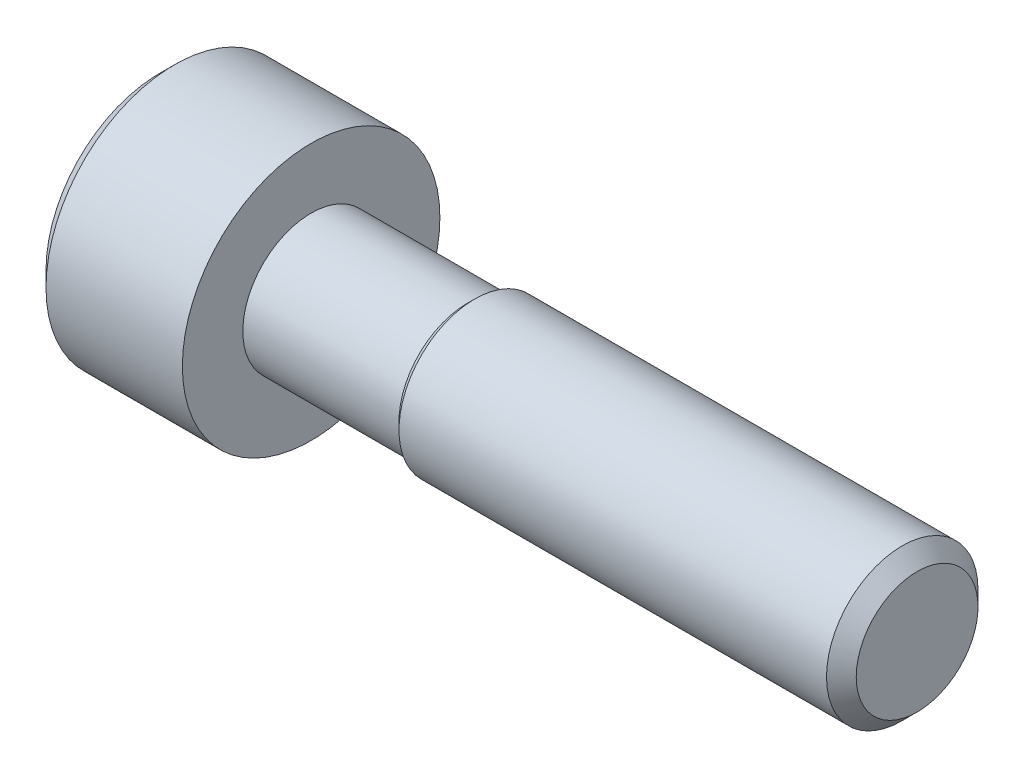
ISO-10303-21;
HEADER;
FILE_DESCRIPTION(('STEP AP214'),'2;1');
FILE_NAME('part.step','',(''),(''),'','','');
FILE_SCHEMA(('AUTOMOTIVE_DESIGN { 1 0 10303 214 1 1 1 1 }'));
ENDSEC;
DATA;
#1=APPLICATION_CONTEXT('core data for automotive mechanical design processes');
#2=APPLICATION_PROTOCOL_DEFINITION('international standard','automotive_design',2000,#1);
#3=PRODUCT_CONTEXT('',#1,'mechanical');
#4=PRODUCT('Part','Part','',(#3));
#5=PRODUCT_RELATED_PRODUCT_CATEGORY('part','',(#4));
#6=PRODUCT_DEFINITION_FORMATION('','',#4);
#7=PRODUCT_DEFINITION_CONTEXT('part definition',#1,'design');
#8=PRODUCT_DEFINITION('design','',#6,#7);
#9=PRODUCT_DEFINITION_SHAPE('','',#8);
#10=(LENGTH_UNIT() NAMED_UNIT(*) SI_UNIT(.MILLI.,.METRE.));
#11=(NAMED_UNIT(*) PLANE_ANGLE_UNIT() SI_UNIT($,.RADIAN.));
#12=(NAMED_UNIT(*) SI_UNIT($,.STERADIAN.) SOLID_ANGLE_UNIT());
#13=UNCERTAINTY_MEASURE_WITH_UNIT(LENGTH_MEASURE(1.E-05),#10,'distance_accuracy_value','');
#14=(GEOMETRIC_REPRESENTATION_CONTEXT(3) GLOBAL_UNCERTAINTY_ASSIGNED_CONTEXT((#13)) GLOBAL_UNIT_ASSIGNED_CONTEXT((#10,
#11,#12)) REPRESENTATION_CONTEXT('',''));
#15=CARTESIAN_POINT('',(0.,0.,0.));
#16=DIRECTION('',(0.,0.,1.));
#17=DIRECTION('',(1.,0.,0.));
#18=AXIS2_PLACEMENT_3D('',#15,#16,#17);
#19=CARTESIAN_POINT('',(-2.5,0.,0.));
#20=DIRECTION('',(1.,0.,0.));
#21=DIRECTION('',(0.,0.,-1.));
#22=AXIS2_PLACEMENT_3D('',#19,#20,#21);
#23=PLANE('',#22);
#24=DIRECTION('',(0.,1.,0.));
#25=VECTOR('',#24,1.);
#26=CARTESIAN_POINT('',(-2.5,0.,2.));
#27=LINE('',#26,#25);
#28=CARTESIAN_POINT('',(-2.5,1.15470053837925,2.));
#29=VERTEX_POINT('',#28);
#30=CARTESIAN_POINT('',(-2.49999999999886,0.,2.00000000000477));
#31=VERTEX_POINT('',#30);
#32=EDGE_CURVE('E87',#29,#31,#27,.F.);
#33=ORIENTED_EDGE('',*,*,#32,.F.);
#34=DIRECTION('',(0.,-0.500000000000003,0.866025403784437));
#35=VECTOR('',#34,1.);
#36=CARTESIAN_POINT('',(-2.5,1.73205080756888,1.));
#37=LINE('',#36,#35);
#38=CARTESIAN_POINT('',(-2.49999999999886,1.73205080757301,1.00000000000239));
#39=VERTEX_POINT('',#38);
#40=EDGE_CURVE('E108',#39,#29,#37,.T.);
#41=ORIENTED_EDGE('',*,*,#40,.F.);
#42=CARTESIAN_POINT('',(-2.49999999999773,0.,0.));
#43=DIRECTION('',(-1.,0.,0.));
#44=DIRECTION('',(0.,0.,1.));
#45=AXIS2_PLACEMENT_3D('',#42,#43,#44);
#46=CIRCLE('',#45,2.00000000000955);
#47=EDGE_CURVE('E20',#39,#31,#46,.F.);
#48=ORIENTED_EDGE('',*,*,#47,.T.);
#49=EDGE_LOOP('',(#33,#41,#48));
#50=FACE_BOUND('',#49,.T.);
#51=ADVANCED_FACE('F17',(#50),#23,.F.);
#52=CARTESIAN_POINT('',(-2.5,0.,0.));
#53=DIRECTION('',(1.,0.,0.));
#54=DIRECTION('',(0.,0.,-1.));
#55=AXIS2_PLACEMENT_3D('',#52,#53,#54);
#56=PLANE('',#55);
#57=DIRECTION('',(0.,-0.500000000000003,-0.866025403784437));
#58=VECTOR('',#57,1.);
#59=CARTESIAN_POINT('',(-2.5,-1.15470053837925,2.));
#60=LINE('',#59,#58);
#61=CARTESIAN_POINT('',(-2.5,-1.15470053837925,2.));
#62=VERTEX_POINT('',#61);
#63=CARTESIAN_POINT('',(-2.49999999999886,-1.73205080757301,1.00000000000239));
#64=VERTEX_POINT('',#63);
#65=EDGE_CURVE('E127',#62,#64,#60,.T.);
#66=ORIENTED_EDGE('',*,*,#65,.F.);
#67=DIRECTION('',(0.,1.,0.));
#68=VECTOR('',#67,1.);
#69=CARTESIAN_POINT('',(-2.5,0.,2.));
#70=LINE('',#69,#68);
#71=EDGE_CURVE('E139',#31,#62,#70,.F.);
#72=ORIENTED_EDGE('',*,*,#71,.F.);
#73=CARTESIAN_POINT('',(-2.49999999999773,0.,0.));
#74=DIRECTION('',(-1.,0.,0.));
#75=DIRECTION('',(0.,0.,1.));
#76=AXIS2_PLACEMENT_3D('',#73,#74,#75);
#77=CIRCLE('',#76,2.00000000000955);
#78=EDGE_CURVE('E118',#31,#64,#77,.F.);
#79=ORIENTED_EDGE('',*,*,#78,.T.);
#80=EDGE_LOOP('',(#66,#72,#79));
#81=FACE_BOUND('',#80,.T.);
#82=ADVANCED_FACE('F252',(#81),#56,.F.);
#83=CARTESIAN_POINT('',(-2.5,0.,0.));
#84=DIRECTION('',(1.,0.,0.));
#85=DIRECTION('',(0.,0.,-1.));
#86=AXIS2_PLACEMENT_3D('',#83,#84,#85);
#87=PLANE('',#86);
#88=DIRECTION('',(0.,0.500000000000003,0.866025403784437));
#89=VECTOR('',#88,1.);
#90=CARTESIAN_POINT('',(-2.5,1.15470053837925,-2.));
#91=LINE('',#90,#89);
#92=CARTESIAN_POINT('',(-2.5,1.15470053837925,-2.));
#93=VERTEX_POINT('',#92);
#94=CARTESIAN_POINT('',(-2.49999999999886,1.73205080757301,-1.00000000000239));
#95=VERTEX_POINT('',#94);
#96=EDGE_CURVE('E119',#93,#95,#91,.T.);
#97=ORIENTED_EDGE('',*,*,#96,.F.);
#98=DIRECTION('',(0.,1.,0.));
#99=VECTOR('',#98,1.);
#100=CARTESIAN_POINT('',(-2.5,0.,-2.));
#101=LINE('',#100,#99);
#102=CARTESIAN_POINT('',(-2.49999999999886,0.,-2.00000000000477));
#103=VERTEX_POINT('',#102);
#104=EDGE_CURVE('E121',#103,#93,#101,.T.);
#105=ORIENTED_EDGE('',*,*,#104,.F.);
#106=CARTESIAN_POINT('',(-2.49999999999773,0.,0.));
#107=DIRECTION('',(-1.,0.,0.));
#108=DIRECTION('',(0.,0.,1.));
#109=AXIS2_PLACEMENT_3D('',#106,#107,#108);
#110=CIRCLE('',#109,2.00000000000955);
#111=EDGE_CURVE('E103',#103,#95,#110,.F.);
#112=ORIENTED_EDGE('',*,*,#111,.T.);
#113=EDGE_LOOP('',(#97,#105,#112));
#114=FACE_BOUND('',#113,.T.);
#115=ADVANCED_FACE('F254',(#114),#87,.F.);
#116=CARTESIAN_POINT('',(-2.49999999999773,0.,0.));
#117=DIRECTION('',(-1.,0.,0.));
#118=DIRECTION('',(0.,0.,1.));
#119=AXIS2_PLACEMENT_3D('',#116,#117,#118);
#120=CONICAL_SURFACE('',#119,2.00000000000955,1.04719755114751);
#121=CARTESIAN_POINT('',(-1.34529946163298,1.4210854715202E-10,0.));
#122=VERTEX_POINT('',#121);
#123=VERTEX_LOOP('',#122);
#124=FACE_BOUND('',#123,.T.);
#125=ORIENTED_EDGE('',*,*,#47,.F.);
#126=CARTESIAN_POINT('',(-2.49999999999773,0.,0.));
#127=DIRECTION('',(-1.,0.,0.));
#128=DIRECTION('',(0.,0.,1.));
#129=AXIS2_PLACEMENT_3D('',#126,#127,#128);
#130=CIRCLE('',#129,2.00000000000955);
#131=EDGE_CURVE('E93',#95,#39,#130,.F.);
#132=ORIENTED_EDGE('',*,*,#131,.F.);
#133=ORIENTED_EDGE('',*,*,#111,.F.);
#134=CARTESIAN_POINT('',(-2.49999999999773,0.,0.));
#135=DIRECTION('',(-1.,0.,0.));
#136=DIRECTION('',(0.,0.,1.));
#137=AXIS2_PLACEMENT_3D('',#134,#135,#136);
#138=CIRCLE('',#137,2.00000000000955);
#139=CARTESIAN_POINT('',(-2.49999999999886,-1.73205080757301,-1.00000000000239));
#140=VERTEX_POINT('',#139);
#141=EDGE_CURVE('E177',#103,#140,#138,.T.);
#142=ORIENTED_EDGE('',*,*,#141,.T.);
#143=CARTESIAN_POINT('',(-2.49999999999773,0.,0.));
#144=DIRECTION('',(-1.,0.,0.));
#145=DIRECTION('',(0.,0.,1.));
#146=AXIS2_PLACEMENT_3D('',#143,#144,#145);
#147=CIRCLE('',#146,2.00000000000955);
#148=EDGE_CURVE('E120',#64,#140,#147,.F.);
#149=ORIENTED_EDGE('',*,*,#148,.F.);
#150=ORIENTED_EDGE('',*,*,#78,.F.);
#151=EDGE_LOOP('',(#125,#132,#133,#142,#149,#150));
#152=FACE_BOUND('',#151,.T.);
#153=ADVANCED_FACE('F116',(#124,#152),#120,.F.);
#154=CARTESIAN_POINT('',(-2.5,0.,0.));
#155=DIRECTION('',(1.,0.,0.));
#156=DIRECTION('',(0.,0.,-1.));
#157=AXIS2_PLACEMENT_3D('',#154,#155,#156);
#158=PLANE('',#157);
#159=DIRECTION('',(0.,1.,0.));
#160=VECTOR('',#159,1.);
#161=CARTESIAN_POINT('',(-2.5,0.,-2.));
#162=LINE('',#161,#160);
#163=CARTESIAN_POINT('',(-2.5,-1.15470053837925,-2.));
#164=VERTEX_POINT('',#163);
#165=EDGE_CURVE('E102',#164,#103,#162,.T.);
#166=ORIENTED_EDGE('',*,*,#165,.F.);
#167=DIRECTION('',(0.,0.5,-0.866025403784439));
#168=VECTOR('',#167,1.);
#169=CARTESIAN_POINT('',(-2.5,-1.15470053837925,-2.));
#170=LINE('',#169,#168);
#171=EDGE_CURVE('E192',#164,#140,#170,.F.);
#172=ORIENTED_EDGE('',*,*,#171,.T.);
#173=ORIENTED_EDGE('',*,*,#141,.F.);
#174=EDGE_LOOP('',(#166,#172,#173));
#175=FACE_BOUND('',#174,.T.);
#176=ADVANCED_FACE('F193',(#175),#158,.F.);
#177=CARTESIAN_POINT('',(-2.5,0.,0.));
#178=DIRECTION('',(1.,0.,0.));
#179=DIRECTION('',(0.,0.,-1.));
#180=AXIS2_PLACEMENT_3D('',#177,#178,#179);
#181=PLANE('',#180);
#182=DIRECTION('',(0.,0.5,-0.866025403784439));
#183=VECTOR('',#182,1.);
#184=CARTESIAN_POINT('',(-2.5,-1.15470053837925,-2.));
#185=LINE('',#184,#183);
#186=CARTESIAN_POINT('',(-2.5,-2.3094010767585,0.));
#187=VERTEX_POINT('',#186);
#188=EDGE_CURVE('E186',#140,#187,#185,.F.);
#189=ORIENTED_EDGE('',*,*,#188,.T.);
#190=DIRECTION('',(0.,-0.5,-0.866025403784439));
#191=VECTOR('',#190,1.);
#192=CARTESIAN_POINT('',(-2.5,-2.3094010767585,0.));
#193=LINE('',#192,#191);
#194=EDGE_CURVE('E179',#187,#64,#193,.F.);
#195=ORIENTED_EDGE('',*,*,#194,.T.);
#196=ORIENTED_EDGE('',*,*,#148,.T.);
#197=EDGE_LOOP('',(#189,#195,#196));
#198=FACE_BOUND('',#197,.T.);
#199=ADVANCED_FACE('F184',(#198),#181,.F.);
#200=CARTESIAN_POINT('',(-2.5,0.,0.));
#201=DIRECTION('',(1.,0.,0.));
#202=DIRECTION('',(0.,0.,-1.));
#203=AXIS2_PLACEMENT_3D('',#200,#201,#202);
#204=PLANE('',#203);
#205=DIRECTION('',(0.,-0.5,0.866025403784439));
#206=VECTOR('',#205,1.);
#207=CARTESIAN_POINT('',(-2.5,1.15470053837925,2.));
#208=LINE('',#207,#206);
#209=CARTESIAN_POINT('',(-2.5,2.3094010767585,0.));
#210=VERTEX_POINT('',#209);
#211=EDGE_CURVE('E96',#39,#210,#208,.F.);
#212=ORIENTED_EDGE('',*,*,#211,.T.);
#213=DIRECTION('',(0.,0.5,0.866025403784439));
#214=VECTOR('',#213,1.);
#215=CARTESIAN_POINT('',(-2.5,2.3094010767585,0.));
#216=LINE('',#215,#214);
#217=EDGE_CURVE('E98',#210,#95,#216,.F.);
#218=ORIENTED_EDGE('',*,*,#217,.T.);
#219=ORIENTED_EDGE('',*,*,#131,.T.);
#220=EDGE_LOOP('',(#212,#218,#219));
#221=FACE_BOUND('',#220,.T.);
#222=ADVANCED_FACE('F95',(#221),#204,.F.);
#223=CARTESIAN_POINT('',(-5.,-2.3094010767585,0.));
#224=DIRECTION('',(0.,-0.866025403784439,0.5));
#225=DIRECTION('',(0.,-0.5,-0.866025403784439));
#226=AXIS2_PLACEMENT_3D('',#223,#224,#225);
#227=PLANE('',#226);
#228=DIRECTION('',(1.,0.,0.));
#229=VECTOR('',#228,1.);
#230=CARTESIAN_POINT('',(-5.,-1.15470053837925,2.));
#231=LINE('',#230,#229);
#232=CARTESIAN_POINT('',(-5.,-1.15470053837925,2.));
#233=VERTEX_POINT('',#232);
#234=EDGE_CURVE('E153',#233,#62,#231,.T.);
#235=ORIENTED_EDGE('',*,*,#234,.T.);
#236=ORIENTED_EDGE('',*,*,#65,.T.);
#237=ORIENTED_EDGE('',*,*,#194,.F.);
#238=DIRECTION('',(1.,0.,0.));
#239=VECTOR('',#238,1.);
#240=CARTESIAN_POINT('',(-5.,-2.3094010767585,0.));
#241=LINE('',#240,#239);
#242=CARTESIAN_POINT('',(-5.,-2.3094010767585,0.));
#243=VERTEX_POINT('',#242);
#244=EDGE_CURVE('E201',#187,#243,#241,.F.);
#245=ORIENTED_EDGE('',*,*,#244,.T.);
#246=DIRECTION('',(0.,-0.499999999999999,-0.866025403784439));
#247=VECTOR('',#246,1.);
#248=CARTESIAN_POINT('',(-5.,-1.15470053837925,2.));
#249=LINE('',#248,#247);
#250=EDGE_CURVE('E159',#233,#243,#249,.T.);
#251=ORIENTED_EDGE('',*,*,#250,.F.);
#252=EDGE_LOOP('',(#235,#236,#237,#245,#251));
#253=FACE_BOUND('',#252,.T.);
#254=ADVANCED_FACE('F248',(#253),#227,.F.);
#255=CARTESIAN_POINT('',(-5.,-1.15470053837925,-2.));
#256=DIRECTION('',(0.,-0.866025403784439,-0.5));
#257=DIRECTION('',(0.,0.5,-0.866025403784439));
#258=AXIS2_PLACEMENT_3D('',#255,#256,#257);
#259=PLANE('',#258);
#260=ORIENTED_EDGE('',*,*,#244,.F.);
#261=ORIENTED_EDGE('',*,*,#188,.F.);
#262=ORIENTED_EDGE('',*,*,#171,.F.);
#263=DIRECTION('',(-1.,0.,0.));
#264=VECTOR('',#263,1.);
#265=CARTESIAN_POINT('',(-5.,-1.15470053837925,-2.));
#266=LINE('',#265,#264);
#267=CARTESIAN_POINT('',(-5.,-1.15470053837925,-2.));
#268=VERTEX_POINT('',#267);
#269=EDGE_CURVE('E203',#164,#268,#266,.T.);
#270=ORIENTED_EDGE('',*,*,#269,.T.);
#271=DIRECTION('',(0.,0.499999999999999,-0.866025403784439));
#272=VECTOR('',#271,1.);
#273=CARTESIAN_POINT('',(-5.,-2.3094010767585,0.));
#274=LINE('',#273,#272);
#275=EDGE_CURVE('E240',#243,#268,#274,.T.);
#276=ORIENTED_EDGE('',*,*,#275,.F.);
#277=EDGE_LOOP('',(#260,#261,#262,#270,#276));
#278=FACE_BOUND('',#277,.T.);
#279=ADVANCED_FACE('F199',(#278),#259,.F.);
#280=CARTESIAN_POINT('',(-5.,1.15470053837925,-2.));
#281=DIRECTION('',(0.,0.,-1.));
#282=DIRECTION('',(-1.,0.,0.));
#283=AXIS2_PLACEMENT_3D('',#280,#281,#282);
#284=PLANE('',#283);
#285=ORIENTED_EDGE('',*,*,#269,.F.);
#286=ORIENTED_EDGE('',*,*,#165,.T.);
#287=ORIENTED_EDGE('',*,*,#104,.T.);
#288=DIRECTION('',(1.,0.,0.));
#289=VECTOR('',#288,1.);
#290=CARTESIAN_POINT('',(-5.,1.15470053837925,-2.));
#291=LINE('',#290,#289);
#292=CARTESIAN_POINT('',(-5.,1.15470053837925,-2.));
#293=VERTEX_POINT('',#292);
#294=EDGE_CURVE('E110',#93,#293,#291,.F.);
#295=ORIENTED_EDGE('',*,*,#294,.T.);
#296=DIRECTION('',(0.,1.,0.));
#297=VECTOR('',#296,1.);
#298=CARTESIAN_POINT('',(-5.,2.875,-2.));
#299=LINE('',#298,#297);
#300=EDGE_CURVE('E238',#268,#293,#299,.T.);
#301=ORIENTED_EDGE('',*,*,#300,.F.);
#302=EDGE_LOOP('',(#285,#286,#287,#295,#301));
#303=FACE_BOUND('',#302,.T.);
#304=ADVANCED_FACE('F308',(#303),#284,.F.);
#305=CARTESIAN_POINT('',(-5.,2.3094010767585,0.));
#306=DIRECTION('',(0.,0.866025403784439,-0.5));
#307=DIRECTION('',(0.,0.5,0.866025403784439));
#308=AXIS2_PLACEMENT_3D('',#305,#306,#307);
#309=PLANE('',#308);
#310=ORIENTED_EDGE('',*,*,#294,.F.);
#311=ORIENTED_EDGE('',*,*,#96,.T.);
#312=ORIENTED_EDGE('',*,*,#217,.F.);
#313=DIRECTION('',(1.,0.,0.));
#314=VECTOR('',#313,1.);
#315=CARTESIAN_POINT('',(-5.,2.3094010767585,0.));
#316=LINE('',#315,#314);
#317=CARTESIAN_POINT('',(-5.,2.3094010767585,0.));
#318=VERTEX_POINT('',#317);
#319=EDGE_CURVE('E109',#210,#318,#316,.F.);
#320=ORIENTED_EDGE('',*,*,#319,.T.);
#321=DIRECTION('',(0.,0.499999999999999,0.866025403784439));
#322=VECTOR('',#321,1.);
#323=CARTESIAN_POINT('',(-5.,1.15470053837925,-2.));
#324=LINE('',#323,#322);
#325=EDGE_CURVE('E229',#293,#318,#324,.T.);
#326=ORIENTED_EDGE('',*,*,#325,.F.);
#327=EDGE_LOOP('',(#310,#311,#312,#320,#326));
#328=FACE_BOUND('',#327,.T.);
#329=ADVANCED_FACE('F227',(#328),#309,.F.);
#330=CARTESIAN_POINT('',(-5.,1.15470053837925,2.));
#331=DIRECTION('',(0.,0.866025403784439,0.5));
#332=DIRECTION('',(0.,-0.5,0.866025403784439));
#333=AXIS2_PLACEMENT_3D('',#330,#331,#332);
#334=PLANE('',#333);
#335=ORIENTED_EDGE('',*,*,#319,.F.);
#336=ORIENTED_EDGE('',*,*,#211,.F.);
#337=ORIENTED_EDGE('',*,*,#40,.T.);
#338=DIRECTION('',(1.,0.,0.));
#339=VECTOR('',#338,1.);
#340=CARTESIAN_POINT('',(-5.,1.15470053837925,2.));
#341=LINE('',#340,#339);
#342=CARTESIAN_POINT('',(-5.,1.15470053837925,2.));
#343=VERTEX_POINT('',#342);
#344=EDGE_CURVE('E35',#29,#343,#341,.F.);
#345=ORIENTED_EDGE('',*,*,#344,.T.);
#346=DIRECTION('',(0.,-0.499999999999999,0.866025403784439));
#347=VECTOR('',#346,1.);
#348=CARTESIAN_POINT('',(-5.,2.3094010767585,0.));
#349=LINE('',#348,#347);
#350=EDGE_CURVE('E232',#318,#343,#349,.T.);
#351=ORIENTED_EDGE('',*,*,#350,.F.);
#352=EDGE_LOOP('',(#335,#336,#337,#345,#351));
#353=FACE_BOUND('',#352,.T.);
#354=ADVANCED_FACE('F107',(#353),#334,.F.);
#355=CARTESIAN_POINT('',(-5.,-1.15470053837925,2.));
#356=DIRECTION('',(0.,0.,1.));
#357=DIRECTION('',(1.,0.,0.));
#358=AXIS2_PLACEMENT_3D('',#355,#356,#357);
#359=PLANE('',#358);
#360=ORIENTED_EDGE('',*,*,#344,.F.);
#361=ORIENTED_EDGE('',*,*,#32,.T.);
#362=ORIENTED_EDGE('',*,*,#71,.T.);
#363=ORIENTED_EDGE('',*,*,#234,.F.);
#364=DIRECTION('',(0.,1.,0.));
#365=VECTOR('',#364,1.);
#366=CARTESIAN_POINT('',(-5.,2.875,2.));
#367=LINE('',#366,#365);
#368=EDGE_CURVE('E176',#343,#233,#367,.F.);
#369=ORIENTED_EDGE('',*,*,#368,.F.);
#370=EDGE_LOOP('',(#360,#361,#362,#363,#369));
#371=FACE_BOUND('',#370,.T.);
#372=ADVANCED_FACE('F250',(#371),#359,.F.);
#373=CARTESIAN_POINT('',(-5.,2.875,0.));
#374=DIRECTION('',(-1.,0.,0.));
#375=DIRECTION('',(0.,0.,1.));
#376=AXIS2_PLACEMENT_3D('',#373,#374,#375);
#377=PLANE('',#376);
#378=CARTESIAN_POINT('',(-4.99999999999545,0.,0.));
#379=DIRECTION('',(1.,0.,0.));
#380=DIRECTION('',(0.,0.,-1.));
#381=AXIS2_PLACEMENT_3D('',#378,#379,#380);
#382=CIRCLE('',#381,3.75000000002501);
#383=CARTESIAN_POINT('',(-4.99999999999545,0.,-3.75000000002501));
#384=VERTEX_POINT('',#383);
#385=EDGE_CURVE('E173',#384,#384,#382,.T.);
#386=ORIENTED_EDGE('',*,*,#385,.F.);
#387=EDGE_LOOP('',(#386));
#388=FACE_BOUND('',#387,.T.);
#389=ORIENTED_EDGE('',*,*,#350,.T.);
#390=ORIENTED_EDGE('',*,*,#368,.T.);
#391=ORIENTED_EDGE('',*,*,#250,.T.);
#392=ORIENTED_EDGE('',*,*,#275,.T.);
#393=ORIENTED_EDGE('',*,*,#300,.T.);
#394=ORIENTED_EDGE('',*,*,#325,.T.);
#395=EDGE_LOOP('',(#389,#390,#391,#392,#393,#394));
#396=FACE_BOUND('',#395,.T.);
#397=ADVANCED_FACE('F236',(#388,#396),#377,.T.);
#398=CARTESIAN_POINT('',(-4.50000000017781,0.,0.));
#399=DIRECTION('',(1.,0.,0.));
#400=DIRECTION('',(0.,0.,-1.));
#401=AXIS2_PLACEMENT_3D('',#398,#399,#400);
#402=CONICAL_SURFACE('',#401,4.24999999984266,0.785398163397448);
#403=ORIENTED_EDGE('',*,*,#385,.T.);
#404=EDGE_LOOP('',(#403));
#405=FACE_BOUND('',#404,.T.);
#406=CARTESIAN_POINT('',(-4.5,0.,0.));
#407=DIRECTION('',(1.,0.,0.));
#408=DIRECTION('',(0.,0.,-1.));
#409=AXIS2_PLACEMENT_3D('',#406,#407,#408);
#410=CIRCLE('',#409,4.25);
#411=CARTESIAN_POINT('',(-4.5,0.,-4.25));
#412=VERTEX_POINT('',#411);
#413=EDGE_CURVE('E172',#412,#412,#410,.T.);
#414=ORIENTED_EDGE('',*,*,#413,.F.);
#415=EDGE_LOOP('',(#414));
#416=FACE_BOUND('',#415,.T.);
#417=ADVANCED_FACE('F294',(#405,#416),#402,.T.);
#418=CARTESIAN_POINT('',(-2.25,0.,0.));
#419=DIRECTION('',(1.,0.,0.));
#420=DIRECTION('',(0.,0.,-1.));
#421=AXIS2_PLACEMENT_3D('',#418,#419,#420);
#422=CYLINDRICAL_SURFACE('',#421,4.25);
#423=ORIENTED_EDGE('',*,*,#413,.T.);
#424=EDGE_LOOP('',(#423));
#425=FACE_BOUND('',#424,.T.);
#426=CARTESIAN_POINT('',(0.,0.,0.));
#427=DIRECTION('',(1.,0.,0.));
#428=DIRECTION('',(0.,0.,-1.));
#429=AXIS2_PLACEMENT_3D('',#426,#427,#428);
#430=CIRCLE('',#429,4.25);
#431=CARTESIAN_POINT('',(0.,0.,-4.25));
#432=VERTEX_POINT('',#431);
#433=EDGE_CURVE('E169',#432,#432,#430,.T.);
#434=ORIENTED_EDGE('',*,*,#433,.F.);
#435=EDGE_LOOP('',(#434));
#436=FACE_BOUND('',#435,.T.);
#437=ADVANCED_FACE('F290',(#425,#436),#422,.T.);
#438=CARTESIAN_POINT('',(0.,3.252133,0.));
#439=DIRECTION('',(1.,0.,0.));
#440=DIRECTION('',(0.,0.,-1.));
#441=AXIS2_PLACEMENT_3D('',#438,#439,#440);
#442=PLANE('',#441);
#443=CARTESIAN_POINT('',(0.,0.,0.));
#444=DIRECTION('',(1.,0.,0.));
#445=DIRECTION('',(0.,0.,-1.));
#446=AXIS2_PLACEMENT_3D('',#443,#444,#445);
#447=CIRCLE('',#446,2.254266);
#448=CARTESIAN_POINT('',(0.,0.,-2.254266));
#449=VERTEX_POINT('',#448);
#450=EDGE_CURVE('E166',#449,#449,#447,.T.);
#451=ORIENTED_EDGE('',*,*,#450,.F.);
#452=EDGE_LOOP('',(#451));
#453=FACE_BOUND('',#452,.T.);
#454=ORIENTED_EDGE('',*,*,#433,.T.);
#455=EDGE_LOOP('',(#454));
#456=FACE_BOUND('',#455,.T.);
#457=ADVANCED_FACE('F286',(#453,#456),#442,.T.);
#458=CARTESIAN_POINT('',(20.,1.00475,0.));
#459=DIRECTION('',(1.,0.,0.));
#460=DIRECTION('',(0.,0.,-1.));
#461=AXIS2_PLACEMENT_3D('',#458,#459,#460);
#462=PLANE('',#461);
#463=CARTESIAN_POINT('',(20.0000000000387,0.,0.));
#464=DIRECTION('',(-1.,0.,0.));
#465=DIRECTION('',(0.,0.,1.));
#466=AXIS2_PLACEMENT_3D('',#463,#464,#465);
#467=CIRCLE('',#466,2.00949999998556);
#468=CARTESIAN_POINT('',(20.0000000000387,0.,2.00949999998556));
#469=VERTEX_POINT('',#468);
#470=EDGE_CURVE('E162',#469,#469,#467,.T.);
#471=ORIENTED_EDGE('',*,*,#470,.F.);
#472=EDGE_LOOP('',(#471));
#473=FACE_BOUND('',#472,.T.);
#474=ADVANCED_FACE('F282',(#473),#462,.T.);
#475=CARTESIAN_POINT('',(2.577133,0.,0.));
#476=DIRECTION('',(1.,0.,0.));
#477=DIRECTION('',(0.,0.,-1.));
#478=AXIS2_PLACEMENT_3D('',#475,#476,#477);
#479=CYLINDRICAL_SURFACE('',#478,2.254266);
#480=CARTESIAN_POINT('',(5.15426600003366,0.,0.));
#481=DIRECTION('',(1.,0.,0.));
#482=DIRECTION('',(0.,1.,0.));
#483=AXIS2_PLACEMENT_3D('',#480,#481,#482);
#484=CIRCLE('',#483,2.25426599996581);
#485=CARTESIAN_POINT('',(5.15426600003366,2.25426599996581,0.));
#486=VERTEX_POINT('',#485);
#487=EDGE_CURVE('E165',#486,#486,#484,.T.);
#488=ORIENTED_EDGE('',*,*,#487,.F.);
#489=EDGE_LOOP('',(#488));
#490=FACE_BOUND('',#489,.T.);
#491=ORIENTED_EDGE('',*,*,#450,.T.);
#492=EDGE_LOOP('',(#491));
#493=FACE_BOUND('',#492,.T.);
#494=ADVANCED_FACE('F278',(#490,#493),#479,.T.);
#495=CARTESIAN_POINT('',(19.5095000000265,0.,0.));
#496=DIRECTION('',(-1.,0.,0.));
#497=DIRECTION('',(0.,0.,1.));
#498=AXIS2_PLACEMENT_3D('',#495,#496,#497);
#499=CONICAL_SURFACE('',#498,2.50000000005457,0.785398163455393);
#500=ORIENTED_EDGE('',*,*,#470,.T.);
#501=EDGE_LOOP('',(#500));
#502=FACE_BOUND('',#501,.T.);
#503=CARTESIAN_POINT('',(19.5095,0.,0.));
#504=DIRECTION('',(1.,0.,0.));
#505=DIRECTION('',(0.,0.,-1.));
#506=AXIS2_PLACEMENT_3D('',#503,#504,#505);
#507=CIRCLE('',#506,2.5);
#508=CARTESIAN_POINT('',(19.5095,0.,-2.5));
#509=VERTEX_POINT('',#508);
#510=EDGE_CURVE('E26',#509,#509,#507,.F.);
#511=ORIENTED_EDGE('',*,*,#510,.F.);
#512=EDGE_LOOP('',(#511));
#513=FACE_BOUND('',#512,.T.);
#514=ADVANCED_FACE('F270',(#502,#513),#499,.T.);
#515=CARTESIAN_POINT('',(5.40000000006557,0.,0.));
#516=DIRECTION('',(1.,0.,0.));
#517=DIRECTION('',(0.,0.,-1.));
#518=AXIS2_PLACEMENT_3D('',#515,#516,#517);
#519=CONICAL_SURFACE('',#518,2.50000000005457,0.785398163513109);
#520=ORIENTED_EDGE('',*,*,#487,.T.);
#521=EDGE_LOOP('',(#520));
#522=FACE_BOUND('',#521,.T.);
#523=CARTESIAN_POINT('',(5.4,0.,0.));
#524=DIRECTION('',(1.,0.,0.));
#525=DIRECTION('',(0.,0.,-1.));
#526=AXIS2_PLACEMENT_3D('',#523,#524,#525);
#527=CIRCLE('',#526,2.5);
#528=CARTESIAN_POINT('',(5.4,0.,-2.5));
#529=VERTEX_POINT('',#528);
#530=EDGE_CURVE('E11',#529,#529,#527,.T.);
#531=ORIENTED_EDGE('',*,*,#530,.F.);
#532=EDGE_LOOP('',(#531));
#533=FACE_BOUND('',#532,.T.);
#534=ADVANCED_FACE('F264',(#522,#533),#519,.T.);
#535=CARTESIAN_POINT('',(12.45475,0.,0.));
#536=DIRECTION('',(1.,0.,0.));
#537=DIRECTION('',(0.,0.,-1.));
#538=AXIS2_PLACEMENT_3D('',#535,#536,#537);
#539=CYLINDRICAL_SURFACE('',#538,2.5);
#540=ORIENTED_EDGE('',*,*,#510,.T.);
#541=EDGE_LOOP('',(#540));
#542=FACE_BOUND('',#541,.T.);
#543=ORIENTED_EDGE('',*,*,#530,.T.);
#544=EDGE_LOOP('',(#543));
#545=FACE_BOUND('',#544,.T.);
#546=ADVANCED_FACE('F262',(#542,#545),#539,.T.);
#547=CLOSED_SHELL('',(#51,#82,#115,#153,#176,#199,#222,#254,#279,#304,#329,#354,#372,#397,#417,
#437,#457,#474,#494,#514,#534,#546));
#548=MANIFOLD_SOLID_BREP('B1',#547);
#549=ADVANCED_BREP_SHAPE_REPRESENTATION('',(#18,#548),#14);
#550=SHAPE_DEFINITION_REPRESENTATION(#9,#549);
ENDSEC;
END-ISO-10303-21;
